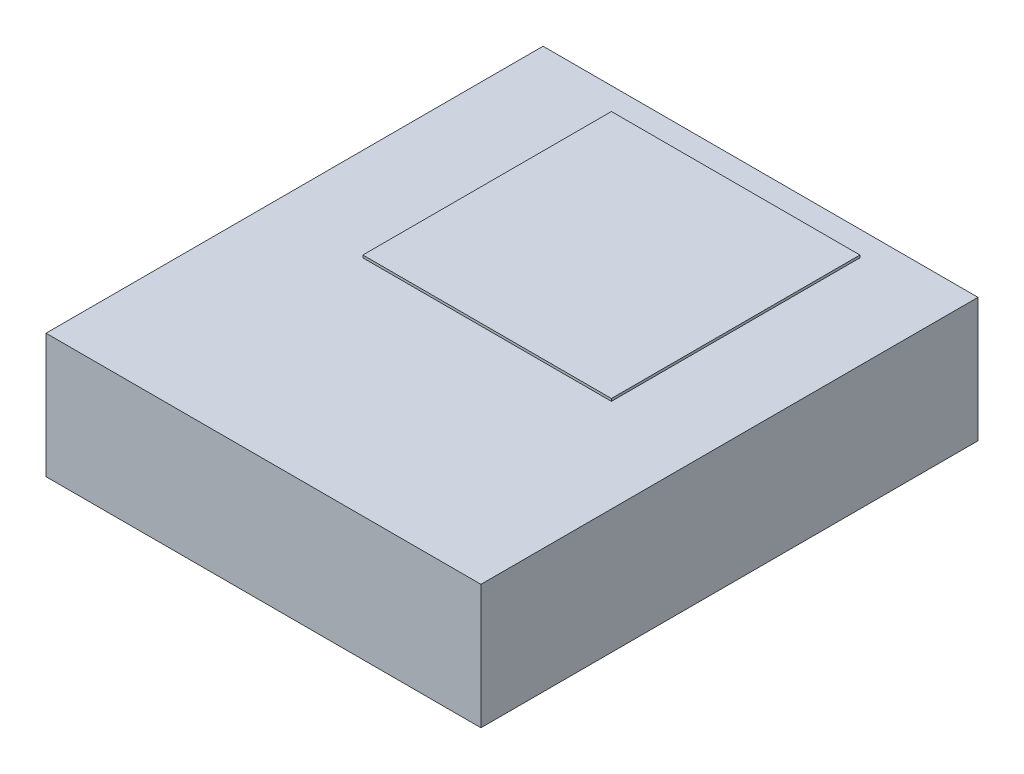
ISO-10303-21;
HEADER;
FILE_DESCRIPTION(('STEP AP214'),'2;1');
FILE_NAME('part.step','',(''),(''),'','','');
FILE_SCHEMA(('AUTOMOTIVE_DESIGN { 1 0 10303 214 1 1 1 1 }'));
ENDSEC;
DATA;
#1=APPLICATION_CONTEXT('core data for automotive mechanical design processes');
#2=APPLICATION_PROTOCOL_DEFINITION('international standard','automotive_design',2000,#1);
#3=PRODUCT_CONTEXT('',#1,'mechanical');
#4=PRODUCT('Part','Part','',(#3));
#5=PRODUCT_RELATED_PRODUCT_CATEGORY('part','',(#4));
#6=PRODUCT_DEFINITION_FORMATION('','',#4);
#7=PRODUCT_DEFINITION_CONTEXT('part definition',#1,'design');
#8=PRODUCT_DEFINITION('design','',#6,#7);
#9=PRODUCT_DEFINITION_SHAPE('','',#8);
#10=(LENGTH_UNIT() NAMED_UNIT(*) SI_UNIT(.MILLI.,.METRE.));
#11=(NAMED_UNIT(*) PLANE_ANGLE_UNIT() SI_UNIT($,.RADIAN.));
#12=(NAMED_UNIT(*) SI_UNIT($,.STERADIAN.) SOLID_ANGLE_UNIT());
#13=UNCERTAINTY_MEASURE_WITH_UNIT(LENGTH_MEASURE(1.E-05),#10,'distance_accuracy_value','');
#14=(GEOMETRIC_REPRESENTATION_CONTEXT(3) GLOBAL_UNCERTAINTY_ASSIGNED_CONTEXT((#13)) GLOBAL_UNIT_ASSIGNED_CONTEXT((#10,
#11,#12)) REPRESENTATION_CONTEXT('',''));
#15=CARTESIAN_POINT('',(0.,0.,0.));
#16=DIRECTION('',(0.,0.,1.));
#17=DIRECTION('',(1.,0.,0.));
#18=AXIS2_PLACEMENT_3D('',#15,#16,#17);
#19=CARTESIAN_POINT('',(0.,0.5,0.));
#20=DIRECTION('',(0.,1.,0.));
#21=DIRECTION('',(0.,0.,1.));
#22=AXIS2_PLACEMENT_3D('',#19,#20,#21);
#23=PLANE('',#22);
#24=DIRECTION('',(0.,0.,1.));
#25=VECTOR('',#24,1.);
#26=CARTESIAN_POINT('',(-13.5390273055639,0.5,5.58185529111577));
#27=LINE('',#26,#25);
#28=CARTESIAN_POINT('',(-13.5390273055639,0.5,5.58185529111577));
#29=VERTEX_POINT('',#28);
#30=CARTESIAN_POINT('',(-13.5390273055639,0.5,7.58185529111577));
#31=VERTEX_POINT('',#30);
#32=EDGE_CURVE('E142',#29,#31,#27,.T.);
#33=ORIENTED_EDGE('',*,*,#32,.T.);
#34=DIRECTION('',(1.,0.,0.));
#35=VECTOR('',#34,1.);
#36=CARTESIAN_POINT('',(-13.5390273055639,0.5,7.58185529111577));
#37=LINE('',#36,#35);
#38=CARTESIAN_POINT('',(-11.7890273055639,0.5,7.58185529111577));
#39=VERTEX_POINT('',#38);
#40=EDGE_CURVE('E87',#31,#39,#37,.T.);
#41=ORIENTED_EDGE('',*,*,#40,.T.);
#42=DIRECTION('',(0.,0.,-1.));
#43=VECTOR('',#42,1.);
#44=CARTESIAN_POINT('',(-11.7890273055639,0.5,5.58185529111577));
#45=LINE('',#44,#43);
#46=CARTESIAN_POINT('',(-11.7890273055639,0.5,5.58185529111577));
#47=VERTEX_POINT('',#46);
#48=EDGE_CURVE('E145',#39,#47,#45,.T.);
#49=ORIENTED_EDGE('',*,*,#48,.T.);
#50=DIRECTION('',(-1.,0.,0.));
#51=VECTOR('',#50,1.);
#52=CARTESIAN_POINT('',(-13.5390273055639,0.5,5.58185529111577));
#53=LINE('',#52,#51);
#54=EDGE_CURVE('E59',#47,#29,#53,.T.);
#55=ORIENTED_EDGE('',*,*,#54,.T.);
#56=EDGE_LOOP('',(#33,#41,#49,#55));
#57=FACE_BOUND('',#56,.T.);
#58=DIRECTION('',(1.,0.,0.));
#59=VECTOR('',#58,1.);
#60=CARTESIAN_POINT('',(-13.1640273055639,0.5,6.68185529111577));
#61=LINE('',#60,#59);
#62=CARTESIAN_POINT('',(-13.1640273055639,0.5,6.68185529111577));
#63=VERTEX_POINT('',#62);
#64=CARTESIAN_POINT('',(-12.1640273055639,0.5,6.68185529111577));
#65=VERTEX_POINT('',#64);
#66=EDGE_CURVE('E267',#63,#65,#61,.T.);
#67=ORIENTED_EDGE('',*,*,#66,.F.);
#68=DIRECTION('',(0.,0.,1.));
#69=VECTOR('',#68,1.);
#70=CARTESIAN_POINT('',(-13.1640273055639,0.5,5.68185529111577));
#71=LINE('',#70,#69);
#72=CARTESIAN_POINT('',(-13.1640273055639,0.5,5.68185529111577));
#73=VERTEX_POINT('',#72);
#74=EDGE_CURVE('E132',#73,#63,#71,.T.);
#75=ORIENTED_EDGE('',*,*,#74,.F.);
#76=DIRECTION('',(-1.,0.,0.));
#77=VECTOR('',#76,1.);
#78=CARTESIAN_POINT('',(-13.1640273055639,0.5,5.68185529111577));
#79=LINE('',#78,#77);
#80=CARTESIAN_POINT('',(-12.1640273055639,0.5,5.68185529111577));
#81=VERTEX_POINT('',#80);
#82=EDGE_CURVE('E128',#81,#73,#79,.T.);
#83=ORIENTED_EDGE('',*,*,#82,.F.);
#84=DIRECTION('',(0.,0.,-1.));
#85=VECTOR('',#84,1.);
#86=CARTESIAN_POINT('',(-12.1640273055639,0.5,5.68185529111577));
#87=LINE('',#86,#85);
#88=EDGE_CURVE('E264',#65,#81,#87,.T.);
#89=ORIENTED_EDGE('',*,*,#88,.F.);
#90=EDGE_LOOP('',(#67,#75,#83,#89));
#91=FACE_BOUND('',#90,.T.);
#92=ADVANCED_FACE('F35',(#57,#91),#23,.T.);
#93=CARTESIAN_POINT('',(-13.5390273055639,0.5,5.58185529111577));
#94=DIRECTION('',(1.,0.,0.));
#95=DIRECTION('',(0.,0.,-1.));
#96=AXIS2_PLACEMENT_3D('',#93,#94,#95);
#97=PLANE('',#96);
#98=DIRECTION('',(0.,0.,1.));
#99=VECTOR('',#98,1.);
#100=CARTESIAN_POINT('',(-13.5390273055639,0.,5.58185529111577));
#101=LINE('',#100,#99);
#102=CARTESIAN_POINT('',(-13.5390273055639,0.,5.58185529111577));
#103=VERTEX_POINT('',#102);
#104=CARTESIAN_POINT('',(-13.5390273055639,0.,7.58185529111577));
#105=VERTEX_POINT('',#104);
#106=EDGE_CURVE('E134',#103,#105,#101,.T.);
#107=ORIENTED_EDGE('',*,*,#106,.T.);
#108=DIRECTION('',(0.,-1.,0.));
#109=VECTOR('',#108,1.);
#110=CARTESIAN_POINT('',(-13.5390273055639,0.5,7.58185529111577));
#111=LINE('',#110,#109);
#112=EDGE_CURVE('E11',#31,#105,#111,.T.);
#113=ORIENTED_EDGE('',*,*,#112,.F.);
#114=ORIENTED_EDGE('',*,*,#32,.F.);
#115=DIRECTION('',(0.,-1.,0.));
#116=VECTOR('',#115,1.);
#117=CARTESIAN_POINT('',(-13.5390273055639,0.5,5.58185529111577));
#118=LINE('',#117,#116);
#119=EDGE_CURVE('E147',#29,#103,#118,.T.);
#120=ORIENTED_EDGE('',*,*,#119,.T.);
#121=EDGE_LOOP('',(#107,#113,#114,#120));
#122=FACE_BOUND('',#121,.T.);
#123=ADVANCED_FACE('F37',(#122),#97,.F.);
#124=CARTESIAN_POINT('',(-13.5390273055639,0.5,7.58185529111577));
#125=DIRECTION('',(0.,0.,-1.));
#126=DIRECTION('',(-1.,0.,0.));
#127=AXIS2_PLACEMENT_3D('',#124,#125,#126);
#128=PLANE('',#127);
#129=DIRECTION('',(1.,0.,0.));
#130=VECTOR('',#129,1.);
#131=CARTESIAN_POINT('',(-13.5390273055639,0.,7.58185529111577));
#132=LINE('',#131,#130);
#133=CARTESIAN_POINT('',(-11.7890273055639,0.,7.58185529111577));
#134=VERTEX_POINT('',#133);
#135=EDGE_CURVE('E137',#105,#134,#132,.T.);
#136=ORIENTED_EDGE('',*,*,#135,.T.);
#137=DIRECTION('',(0.,-1.,0.));
#138=VECTOR('',#137,1.);
#139=CARTESIAN_POINT('',(-11.7890273055639,0.5,7.58185529111577));
#140=LINE('',#139,#138);
#141=EDGE_CURVE('E43',#39,#134,#140,.T.);
#142=ORIENTED_EDGE('',*,*,#141,.F.);
#143=ORIENTED_EDGE('',*,*,#40,.F.);
#144=ORIENTED_EDGE('',*,*,#112,.T.);
#145=EDGE_LOOP('',(#136,#142,#143,#144));
#146=FACE_BOUND('',#145,.T.);
#147=ADVANCED_FACE('F175',(#146),#128,.F.);
#148=CARTESIAN_POINT('',(-11.7890273055639,0.5,5.58185529111577));
#149=DIRECTION('',(-1.,0.,0.));
#150=DIRECTION('',(0.,0.,1.));
#151=AXIS2_PLACEMENT_3D('',#148,#149,#150);
#152=PLANE('',#151);
#153=DIRECTION('',(0.,0.,-1.));
#154=VECTOR('',#153,1.);
#155=CARTESIAN_POINT('',(-11.7890273055639,0.,5.58185529111577));
#156=LINE('',#155,#154);
#157=CARTESIAN_POINT('',(-11.7890273055639,0.,5.58185529111577));
#158=VERTEX_POINT('',#157);
#159=EDGE_CURVE('E150',#134,#158,#156,.T.);
#160=ORIENTED_EDGE('',*,*,#159,.T.);
#161=DIRECTION('',(0.,-1.,0.));
#162=VECTOR('',#161,1.);
#163=CARTESIAN_POINT('',(-11.7890273055639,0.5,5.58185529111577));
#164=LINE('',#163,#162);
#165=EDGE_CURVE('E154',#47,#158,#164,.T.);
#166=ORIENTED_EDGE('',*,*,#165,.F.);
#167=ORIENTED_EDGE('',*,*,#48,.F.);
#168=ORIENTED_EDGE('',*,*,#141,.T.);
#169=EDGE_LOOP('',(#160,#166,#167,#168));
#170=FACE_BOUND('',#169,.T.);
#171=ADVANCED_FACE('F159',(#170),#152,.F.);
#172=CARTESIAN_POINT('',(-13.5390273055639,0.5,5.58185529111577));
#173=DIRECTION('',(0.,0.,1.));
#174=DIRECTION('',(1.,0.,0.));
#175=AXIS2_PLACEMENT_3D('',#172,#173,#174);
#176=PLANE('',#175);
#177=DIRECTION('',(-1.,0.,0.));
#178=VECTOR('',#177,1.);
#179=CARTESIAN_POINT('',(-13.5390273055639,0.,5.58185529111577));
#180=LINE('',#179,#178);
#181=EDGE_CURVE('E80',#158,#103,#180,.T.);
#182=ORIENTED_EDGE('',*,*,#181,.T.);
#183=ORIENTED_EDGE('',*,*,#119,.F.);
#184=ORIENTED_EDGE('',*,*,#54,.F.);
#185=ORIENTED_EDGE('',*,*,#165,.T.);
#186=EDGE_LOOP('',(#182,#183,#184,#185));
#187=FACE_BOUND('',#186,.T.);
#188=ADVANCED_FACE('F167',(#187),#176,.F.);
#189=CARTESIAN_POINT('',(0.,0.,0.));
#190=DIRECTION('',(0.,1.,0.));
#191=DIRECTION('',(0.,0.,1.));
#192=AXIS2_PLACEMENT_3D('',#189,#190,#191);
#193=PLANE('',#192);
#194=ORIENTED_EDGE('',*,*,#106,.F.);
#195=ORIENTED_EDGE('',*,*,#181,.F.);
#196=ORIENTED_EDGE('',*,*,#159,.F.);
#197=ORIENTED_EDGE('',*,*,#135,.F.);
#198=EDGE_LOOP('',(#194,#195,#196,#197));
#199=FACE_BOUND('',#198,.T.);
#200=ADVANCED_FACE('F163',(#199),#193,.F.);
#201=CARTESIAN_POINT('',(-13.1640273055639,0.51,5.68185529111577));
#202=DIRECTION('',(1.,0.,0.));
#203=DIRECTION('',(0.,0.,-1.));
#204=AXIS2_PLACEMENT_3D('',#201,#202,#203);
#205=PLANE('',#204);
#206=ORIENTED_EDGE('',*,*,#74,.T.);
#207=DIRECTION('',(0.,-1.,0.));
#208=VECTOR('',#207,1.);
#209=CARTESIAN_POINT('',(-13.1640273055639,0.51,6.68185529111577));
#210=LINE('',#209,#208);
#211=CARTESIAN_POINT('',(-13.1640273055639,0.51,6.68185529111577));
#212=VERTEX_POINT('',#211);
#213=EDGE_CURVE('E113',#212,#63,#210,.T.);
#214=ORIENTED_EDGE('',*,*,#213,.F.);
#215=DIRECTION('',(0.,0.,1.));
#216=VECTOR('',#215,1.);
#217=CARTESIAN_POINT('',(-13.1640273055639,0.51,5.68185529111577));
#218=LINE('',#217,#216);
#219=CARTESIAN_POINT('',(-13.1640273055639,0.51,5.68185529111577));
#220=VERTEX_POINT('',#219);
#221=EDGE_CURVE('E120',#220,#212,#218,.T.);
#222=ORIENTED_EDGE('',*,*,#221,.F.);
#223=DIRECTION('',(0.,-1.,0.));
#224=VECTOR('',#223,1.);
#225=CARTESIAN_POINT('',(-13.1640273055639,0.51,5.68185529111577));
#226=LINE('',#225,#224);
#227=EDGE_CURVE('E262',#220,#73,#226,.T.);
#228=ORIENTED_EDGE('',*,*,#227,.T.);
#229=EDGE_LOOP('',(#206,#214,#222,#228));
#230=FACE_BOUND('',#229,.T.);
#231=ADVANCED_FACE('F130',(#230),#205,.F.);
#232=CARTESIAN_POINT('',(-13.1640273055639,0.51,6.68185529111577));
#233=DIRECTION('',(0.,0.,-1.));
#234=DIRECTION('',(-1.,0.,0.));
#235=AXIS2_PLACEMENT_3D('',#232,#233,#234);
#236=PLANE('',#235);
#237=ORIENTED_EDGE('',*,*,#66,.T.);
#238=DIRECTION('',(0.,-1.,0.));
#239=VECTOR('',#238,1.);
#240=CARTESIAN_POINT('',(-12.1640273055639,0.51,6.68185529111577));
#241=LINE('',#240,#239);
#242=CARTESIAN_POINT('',(-12.1640273055639,0.51,6.68185529111577));
#243=VERTEX_POINT('',#242);
#244=EDGE_CURVE('E116',#243,#65,#241,.T.);
#245=ORIENTED_EDGE('',*,*,#244,.F.);
#246=DIRECTION('',(1.,0.,0.));
#247=VECTOR('',#246,1.);
#248=CARTESIAN_POINT('',(-13.1640273055639,0.51,6.68185529111577));
#249=LINE('',#248,#247);
#250=EDGE_CURVE('E109',#212,#243,#249,.T.);
#251=ORIENTED_EDGE('',*,*,#250,.F.);
#252=ORIENTED_EDGE('',*,*,#213,.T.);
#253=EDGE_LOOP('',(#237,#245,#251,#252));
#254=FACE_BOUND('',#253,.T.);
#255=ADVANCED_FACE('F111',(#254),#236,.F.);
#256=CARTESIAN_POINT('',(-12.1640273055639,0.51,5.68185529111577));
#257=DIRECTION('',(-1.,0.,0.));
#258=DIRECTION('',(0.,0.,1.));
#259=AXIS2_PLACEMENT_3D('',#256,#257,#258);
#260=PLANE('',#259);
#261=ORIENTED_EDGE('',*,*,#88,.T.);
#262=DIRECTION('',(0.,-1.,0.));
#263=VECTOR('',#262,1.);
#264=CARTESIAN_POINT('',(-12.1640273055639,0.51,5.68185529111577));
#265=LINE('',#264,#263);
#266=CARTESIAN_POINT('',(-12.1640273055639,0.51,5.68185529111577));
#267=VERTEX_POINT('',#266);
#268=EDGE_CURVE('E50',#267,#81,#265,.T.);
#269=ORIENTED_EDGE('',*,*,#268,.F.);
#270=DIRECTION('',(0.,0.,-1.));
#271=VECTOR('',#270,1.);
#272=CARTESIAN_POINT('',(-12.1640273055639,0.51,5.68185529111577));
#273=LINE('',#272,#271);
#274=EDGE_CURVE('E119',#243,#267,#273,.T.);
#275=ORIENTED_EDGE('',*,*,#274,.F.);
#276=ORIENTED_EDGE('',*,*,#244,.T.);
#277=EDGE_LOOP('',(#261,#269,#275,#276));
#278=FACE_BOUND('',#277,.T.);
#279=ADVANCED_FACE('F188',(#278),#260,.F.);
#280=CARTESIAN_POINT('',(-13.1640273055639,0.51,5.68185529111577));
#281=DIRECTION('',(0.,0.,1.));
#282=DIRECTION('',(1.,0.,0.));
#283=AXIS2_PLACEMENT_3D('',#280,#281,#282);
#284=PLANE('',#283);
#285=ORIENTED_EDGE('',*,*,#82,.T.);
#286=ORIENTED_EDGE('',*,*,#227,.F.);
#287=DIRECTION('',(-1.,0.,0.));
#288=VECTOR('',#287,1.);
#289=CARTESIAN_POINT('',(-13.1640273055639,0.51,5.68185529111577));
#290=LINE('',#289,#288);
#291=EDGE_CURVE('E124',#267,#220,#290,.T.);
#292=ORIENTED_EDGE('',*,*,#291,.F.);
#293=ORIENTED_EDGE('',*,*,#268,.T.);
#294=EDGE_LOOP('',(#285,#286,#292,#293));
#295=FACE_BOUND('',#294,.T.);
#296=ADVANCED_FACE('F191',(#295),#284,.F.);
#297=CARTESIAN_POINT('',(0.,0.51,0.));
#298=DIRECTION('',(0.,1.,0.));
#299=DIRECTION('',(0.,0.,1.));
#300=AXIS2_PLACEMENT_3D('',#297,#298,#299);
#301=PLANE('',#300);
#302=ORIENTED_EDGE('',*,*,#221,.T.);
#303=ORIENTED_EDGE('',*,*,#250,.T.);
#304=ORIENTED_EDGE('',*,*,#274,.T.);
#305=ORIENTED_EDGE('',*,*,#291,.T.);
#306=EDGE_LOOP('',(#302,#303,#304,#305));
#307=FACE_BOUND('',#306,.T.);
#308=ADVANCED_FACE('F123',(#307),#301,.T.);
#309=CLOSED_SHELL('',(#92,#123,#147,#171,#188,#200,#231,#255,#279,#296,#308));
#310=MANIFOLD_SOLID_BREP('B2',#309);
#311=ADVANCED_BREP_SHAPE_REPRESENTATION('',(#18,#310),#14);
#312=SHAPE_DEFINITION_REPRESENTATION(#9,#311);
ENDSEC;
END-ISO-10303-21;
